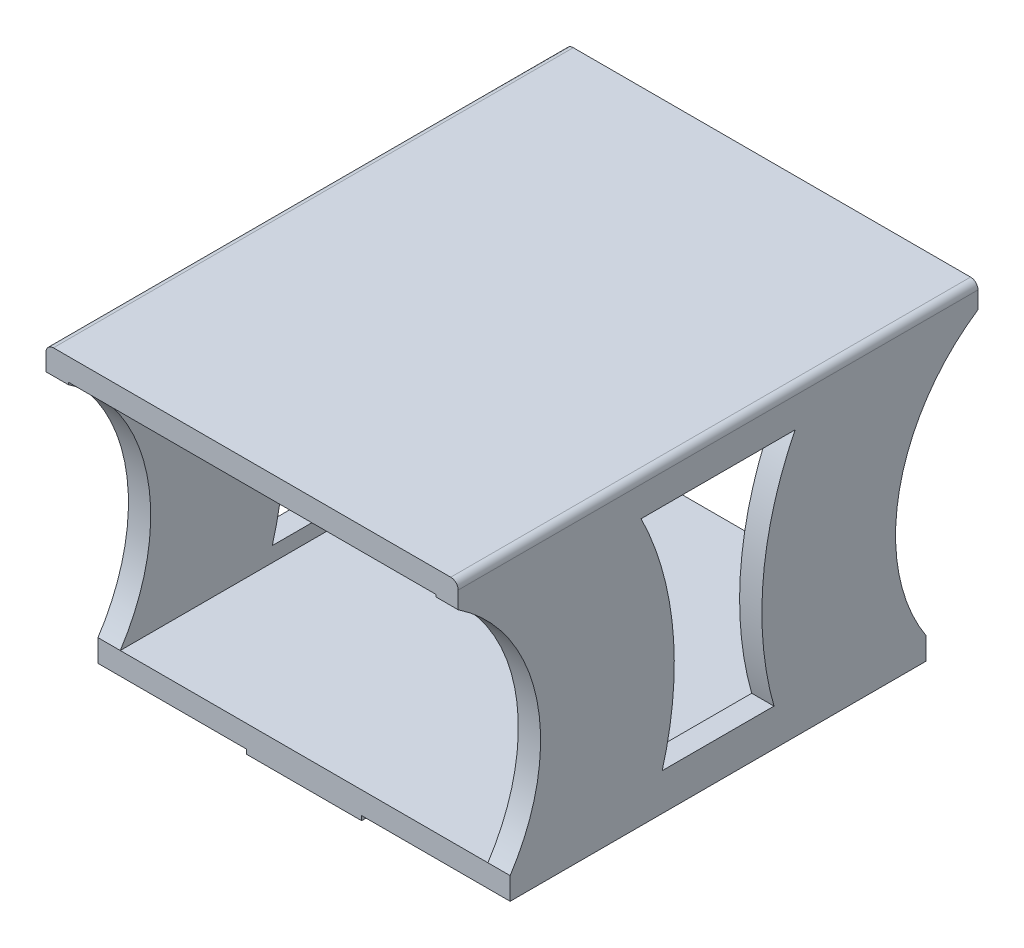
ISO-10303-21;
HEADER;
FILE_DESCRIPTION(('STEP AP214'),'2;1');
FILE_NAME('part.step','',(''),(''),'','','');
FILE_SCHEMA(('AUTOMOTIVE_DESIGN { 1 0 10303 214 1 1 1 1 }'));
ENDSEC;
DATA;
#1=APPLICATION_CONTEXT('core data for automotive mechanical design processes');
#2=APPLICATION_PROTOCOL_DEFINITION('international standard','automotive_design',2000,#1);
#3=PRODUCT_CONTEXT('',#1,'mechanical');
#4=PRODUCT('Part','Part','',(#3));
#5=PRODUCT_RELATED_PRODUCT_CATEGORY('part','',(#4));
#6=PRODUCT_DEFINITION_FORMATION('','',#4);
#7=PRODUCT_DEFINITION_CONTEXT('part definition',#1,'design');
#8=PRODUCT_DEFINITION('design','',#6,#7);
#9=PRODUCT_DEFINITION_SHAPE('','',#8);
#10=(LENGTH_UNIT() NAMED_UNIT(*) SI_UNIT(.MILLI.,.METRE.));
#11=(NAMED_UNIT(*) PLANE_ANGLE_UNIT() SI_UNIT($,.RADIAN.));
#12=(NAMED_UNIT(*) SI_UNIT($,.STERADIAN.) SOLID_ANGLE_UNIT());
#13=UNCERTAINTY_MEASURE_WITH_UNIT(LENGTH_MEASURE(1.E-05),#10,'distance_accuracy_value','');
#14=(GEOMETRIC_REPRESENTATION_CONTEXT(3) GLOBAL_UNCERTAINTY_ASSIGNED_CONTEXT((#13)) GLOBAL_UNIT_ASSIGNED_CONTEXT((#10,
#11,#12)) REPRESENTATION_CONTEXT('',''));
#15=CARTESIAN_POINT('',(0.,0.,0.));
#16=DIRECTION('',(0.,0.,1.));
#17=DIRECTION('',(1.,0.,0.));
#18=AXIS2_PLACEMENT_3D('',#15,#16,#17);
#19=CARTESIAN_POINT('',(0.,0.,0.));
#20=DIRECTION('',(0.,1.,0.));
#21=DIRECTION('',(0.,0.,1.));
#22=AXIS2_PLACEMENT_3D('',#19,#20,#21);
#23=PLANE('',#22);
#24=DIRECTION('',(0.,0.,-1.));
#25=VECTOR('',#24,1.);
#26=CARTESIAN_POINT('',(-7.75,0.,28.));
#27=LINE('',#26,#25);
#28=CARTESIAN_POINT('',(-7.75,0.,28.));
#29=VERTEX_POINT('',#28);
#30=CARTESIAN_POINT('',(-7.75,0.,-28.));
#31=VERTEX_POINT('',#30);
#32=EDGE_CURVE('E252',#29,#31,#27,.T.);
#33=ORIENTED_EDGE('',*,*,#32,.F.);
#34=DIRECTION('',(1.,0.,0.));
#35=VECTOR('',#34,1.);
#36=CARTESIAN_POINT('',(-27.75,0.,28.));
#37=LINE('',#36,#35);
#38=CARTESIAN_POINT('',(-27.75,0.,28.));
#39=VERTEX_POINT('',#38);
#40=EDGE_CURVE('E441',#39,#29,#37,.T.);
#41=ORIENTED_EDGE('',*,*,#40,.F.);
#42=DIRECTION('',(0.,0.,1.));
#43=VECTOR('',#42,1.);
#44=CARTESIAN_POINT('',(-27.75,0.,-28.));
#45=LINE('',#44,#43);
#46=CARTESIAN_POINT('',(-27.75,0.,-28.));
#47=VERTEX_POINT('',#46);
#48=EDGE_CURVE('E452',#47,#39,#45,.T.);
#49=ORIENTED_EDGE('',*,*,#48,.F.);
#50=DIRECTION('',(-1.,0.,0.));
#51=VECTOR('',#50,1.);
#52=CARTESIAN_POINT('',(-27.75,0.,-28.));
#53=LINE('',#52,#51);
#54=EDGE_CURVE('E449',#31,#47,#53,.T.);
#55=ORIENTED_EDGE('',*,*,#54,.F.);
#56=EDGE_LOOP('',(#33,#41,#49,#55));
#57=FACE_BOUND('',#56,.T.);
#58=ADVANCED_FACE('F41',(#57),#23,.F.);
#59=DIRECTION('',(0.,0.,1.));
#60=VECTOR('',#59,1.);
#61=CARTESIAN_POINT('',(7.75,0.,28.));
#62=LINE('',#61,#60);
#63=CARTESIAN_POINT('',(7.75,0.,-28.));
#64=VERTEX_POINT('',#63);
#65=CARTESIAN_POINT('',(7.75,0.,28.));
#66=VERTEX_POINT('',#65);
#67=EDGE_CURVE('E581',#64,#66,#62,.T.);
#68=ORIENTED_EDGE('',*,*,#67,.F.);
#69=CARTESIAN_POINT('',(27.75,0.,-28.));
#70=VERTEX_POINT('',#69);
#71=EDGE_CURVE('E258',#70,#64,#53,.T.);
#72=ORIENTED_EDGE('',*,*,#71,.F.);
#73=DIRECTION('',(0.,0.,-1.));
#74=VECTOR('',#73,1.);
#75=CARTESIAN_POINT('',(27.75,0.,-28.));
#76=LINE('',#75,#74);
#77=CARTESIAN_POINT('',(27.75,0.,28.));
#78=VERTEX_POINT('',#77);
#79=EDGE_CURVE('E435',#78,#70,#76,.T.);
#80=ORIENTED_EDGE('',*,*,#79,.F.);
#81=EDGE_CURVE('E456',#66,#78,#37,.T.);
#82=ORIENTED_EDGE('',*,*,#81,.F.);
#83=EDGE_LOOP('',(#68,#72,#80,#82));
#84=FACE_BOUND('',#83,.T.);
#85=ADVANCED_FACE('F611',(#84),#23,.F.);
#86=CARTESIAN_POINT('',(27.75,3.,-28.));
#87=DIRECTION('',(-1.,0.,0.));
#88=DIRECTION('',(0.,0.,1.));
#89=AXIS2_PLACEMENT_3D('',#86,#87,#88);
#90=PLANE('',#89);
#91=CARTESIAN_POINT('',(27.75,16.7197694496603,48.8989934266741));
#92=DIRECTION('',(1.,0.,0.));
#93=DIRECTION('',(0.,0.,-1.));
#94=AXIS2_PLACEMENT_3D('',#91,#92,#93);
#95=CIRCLE('',#94,43.);
#96=CARTESIAN_POINT('',(27.75,5.,7.52693759128191));
#97=VERTEX_POINT('',#96);
#98=CARTESIAN_POINT('',(27.75,35.8,10.3640118885199));
#99=VERTEX_POINT('',#98);
#100=EDGE_CURVE('E281',#97,#99,#95,.T.);
#101=ORIENTED_EDGE('',*,*,#100,.T.);
#102=DIRECTION('',(0.,0.,-1.));
#103=VECTOR('',#102,1.);
#104=CARTESIAN_POINT('',(27.75,35.8,10.3640118885199));
#105=LINE('',#104,#103);
#106=CARTESIAN_POINT('',(27.75,35.8,-10.3640118885199));
#107=VERTEX_POINT('',#106);
#108=EDGE_CURVE('E293',#99,#107,#105,.T.);
#109=ORIENTED_EDGE('',*,*,#108,.T.);
#110=CARTESIAN_POINT('',(27.75,16.7197694496603,-48.8989934266741));
#111=DIRECTION('',(-1.,0.,0.));
#112=DIRECTION('',(0.,0.,1.));
#113=AXIS2_PLACEMENT_3D('',#110,#111,#112);
#114=CIRCLE('',#113,43.);
#115=CARTESIAN_POINT('',(27.75,5.,-7.52693759128192));
#116=VERTEX_POINT('',#115);
#117=EDGE_CURVE('E297',#116,#107,#114,.T.);
#118=ORIENTED_EDGE('',*,*,#117,.F.);
#119=DIRECTION('',(0.,0.,-1.));
#120=VECTOR('',#119,1.);
#121=CARTESIAN_POINT('',(27.75,5.,7.52693759128192));
#122=LINE('',#121,#120);
#123=EDGE_CURVE('E301',#97,#116,#122,.T.);
#124=ORIENTED_EDGE('',*,*,#123,.F.);
#125=EDGE_LOOP('',(#101,#109,#118,#124));
#126=FACE_BOUND('',#125,.T.);
#127=DIRECTION('',(0.,1.,0.));
#128=VECTOR('',#127,1.);
#129=CARTESIAN_POINT('',(27.75,37.5,-35.));
#130=LINE('',#129,#128);
#131=CARTESIAN_POINT('',(27.75,37.5,-35.));
#132=VERTEX_POINT('',#131);
#133=CARTESIAN_POINT('',(27.75,39.8,-35.));
#134=VERTEX_POINT('',#133);
#135=EDGE_CURVE('E372',#132,#134,#130,.T.);
#136=ORIENTED_EDGE('',*,*,#135,.T.);
#137=DIRECTION('',(0.,0.,-1.));
#138=VECTOR('',#137,1.);
#139=CARTESIAN_POINT('',(27.75,39.8,-28.));
#140=LINE('',#139,#138);
#141=CARTESIAN_POINT('',(27.75,39.8,35.));
#142=VERTEX_POINT('',#141);
#143=EDGE_CURVE('E65',#134,#142,#140,.F.);
#144=ORIENTED_EDGE('',*,*,#143,.T.);
#145=DIRECTION('',(0.,1.,0.));
#146=VECTOR('',#145,1.);
#147=CARTESIAN_POINT('',(27.75,40.8,35.));
#148=LINE('',#147,#146);
#149=CARTESIAN_POINT('',(27.75,37.5,35.));
#150=VERTEX_POINT('',#149);
#151=EDGE_CURVE('E368',#150,#142,#148,.T.);
#152=ORIENTED_EDGE('',*,*,#151,.F.);
#153=CARTESIAN_POINT('',(27.75,16.7197694496603,48.8989934266741));
#154=DIRECTION('',(1.,0.,0.));
#155=DIRECTION('',(0.,0.,-1.));
#156=AXIS2_PLACEMENT_3D('',#153,#154,#155);
#157=CIRCLE('',#156,25.);
#158=CARTESIAN_POINT('',(27.75,2.99999999999999,28.));
#159=VERTEX_POINT('',#158);
#160=EDGE_CURVE('E279',#159,#150,#157,.T.);
#161=ORIENTED_EDGE('',*,*,#160,.F.);
#162=DIRECTION('',(0.,-1.,0.));
#163=VECTOR('',#162,1.);
#164=CARTESIAN_POINT('',(27.75,3.,28.));
#165=LINE('',#164,#163);
#166=EDGE_CURVE('E445',#159,#78,#165,.T.);
#167=ORIENTED_EDGE('',*,*,#166,.T.);
#168=ORIENTED_EDGE('',*,*,#79,.T.);
#169=DIRECTION('',(0.,-1.,0.));
#170=VECTOR('',#169,1.);
#171=CARTESIAN_POINT('',(27.75,3.,-28.));
#172=LINE('',#171,#170);
#173=CARTESIAN_POINT('',(27.75,3.,-28.));
#174=VERTEX_POINT('',#173);
#175=EDGE_CURVE('E470',#174,#70,#172,.T.);
#176=ORIENTED_EDGE('',*,*,#175,.F.);
#177=CARTESIAN_POINT('',(27.75,16.7197694496603,-48.8989934266741));
#178=DIRECTION('',(-1.,0.,0.));
#179=DIRECTION('',(0.,0.,1.));
#180=AXIS2_PLACEMENT_3D('',#177,#178,#179);
#181=CIRCLE('',#180,25.);
#182=EDGE_CURVE('E286',#174,#132,#181,.T.);
#183=ORIENTED_EDGE('',*,*,#182,.T.);
#184=EDGE_LOOP('',(#136,#144,#152,#161,#167,#168,#176,#183));
#185=FACE_BOUND('',#184,.T.);
#186=ADVANCED_FACE('F523',(#126,#185),#90,.F.);
#187=CARTESIAN_POINT('',(-27.75,3.,-28.));
#188=DIRECTION('',(1.,0.,0.));
#189=DIRECTION('',(0.,0.,-1.));
#190=AXIS2_PLACEMENT_3D('',#187,#188,#189);
#191=PLANE('',#190);
#192=CARTESIAN_POINT('',(-27.75,16.7197694496603,48.8989934266741));
#193=DIRECTION('',(1.,0.,0.));
#194=DIRECTION('',(0.,0.,-1.));
#195=AXIS2_PLACEMENT_3D('',#192,#193,#194);
#196=CIRCLE('',#195,43.);
#197=CARTESIAN_POINT('',(-27.75,5.,7.52693759128192));
#198=VERTEX_POINT('',#197);
#199=CARTESIAN_POINT('',(-27.75,35.8,10.3640118885199));
#200=VERTEX_POINT('',#199);
#201=EDGE_CURVE('E305',#198,#200,#196,.T.);
#202=ORIENTED_EDGE('',*,*,#201,.F.);
#203=DIRECTION('',(0.,0.,-1.));
#204=VECTOR('',#203,1.);
#205=CARTESIAN_POINT('',(-27.75,5.,7.52693759128192));
#206=LINE('',#205,#204);
#207=CARTESIAN_POINT('',(-27.75,5.,-7.52693759128191));
#208=VERTEX_POINT('',#207);
#209=EDGE_CURVE('E315',#198,#208,#206,.T.);
#210=ORIENTED_EDGE('',*,*,#209,.T.);
#211=CARTESIAN_POINT('',(-27.75,16.7197694496603,-48.8989934266741));
#212=DIRECTION('',(-1.,0.,0.));
#213=DIRECTION('',(0.,0.,1.));
#214=AXIS2_PLACEMENT_3D('',#211,#212,#213);
#215=CIRCLE('',#214,43.);
#216=CARTESIAN_POINT('',(-27.75,35.8,-10.3640118885199));
#217=VERTEX_POINT('',#216);
#218=EDGE_CURVE('E311',#208,#217,#215,.T.);
#219=ORIENTED_EDGE('',*,*,#218,.T.);
#220=DIRECTION('',(0.,0.,-1.));
#221=VECTOR('',#220,1.);
#222=CARTESIAN_POINT('',(-27.75,35.8,10.3640118885199));
#223=LINE('',#222,#221);
#224=EDGE_CURVE('E308',#200,#217,#223,.T.);
#225=ORIENTED_EDGE('',*,*,#224,.F.);
#226=EDGE_LOOP('',(#202,#210,#219,#225));
#227=FACE_BOUND('',#226,.T.);
#228=DIRECTION('',(0.,-1.,0.));
#229=VECTOR('',#228,1.);
#230=CARTESIAN_POINT('',(-27.75,40.8,35.));
#231=LINE('',#230,#229);
#232=CARTESIAN_POINT('',(-27.75,39.8,35.));
#233=VERTEX_POINT('',#232);
#234=CARTESIAN_POINT('',(-27.75,37.5,35.));
#235=VERTEX_POINT('',#234);
#236=EDGE_CURVE('E375',#233,#235,#231,.T.);
#237=ORIENTED_EDGE('',*,*,#236,.F.);
#238=DIRECTION('',(0.,0.,-1.));
#239=VECTOR('',#238,1.);
#240=CARTESIAN_POINT('',(-27.75,39.8,-28.));
#241=LINE('',#240,#239);
#242=CARTESIAN_POINT('',(-27.75,39.8,-35.));
#243=VERTEX_POINT('',#242);
#244=EDGE_CURVE('E11',#233,#243,#241,.T.);
#245=ORIENTED_EDGE('',*,*,#244,.T.);
#246=DIRECTION('',(0.,-1.,0.));
#247=VECTOR('',#246,1.);
#248=CARTESIAN_POINT('',(-27.75,37.5,-35.));
#249=LINE('',#248,#247);
#250=CARTESIAN_POINT('',(-27.75,37.5,-35.));
#251=VERTEX_POINT('',#250);
#252=EDGE_CURVE('E393',#243,#251,#249,.T.);
#253=ORIENTED_EDGE('',*,*,#252,.T.);
#254=CARTESIAN_POINT('',(-27.75,16.7197694496603,-48.8989934266741));
#255=DIRECTION('',(-1.,0.,0.));
#256=DIRECTION('',(0.,0.,1.));
#257=AXIS2_PLACEMENT_3D('',#254,#255,#256);
#258=CIRCLE('',#257,25.);
#259=CARTESIAN_POINT('',(-27.75,3.,-28.));
#260=VERTEX_POINT('',#259);
#261=EDGE_CURVE('E264',#260,#251,#258,.T.);
#262=ORIENTED_EDGE('',*,*,#261,.F.);
#263=DIRECTION('',(0.,-1.,0.));
#264=VECTOR('',#263,1.);
#265=CARTESIAN_POINT('',(-27.75,3.,-28.));
#266=LINE('',#265,#264);
#267=EDGE_CURVE('E466',#260,#47,#266,.T.);
#268=ORIENTED_EDGE('',*,*,#267,.T.);
#269=ORIENTED_EDGE('',*,*,#48,.T.);
#270=DIRECTION('',(0.,-1.,0.));
#271=VECTOR('',#270,1.);
#272=CARTESIAN_POINT('',(-27.75,3.,28.));
#273=LINE('',#272,#271);
#274=CARTESIAN_POINT('',(-27.75,3.,28.));
#275=VERTEX_POINT('',#274);
#276=EDGE_CURVE('E463',#275,#39,#273,.T.);
#277=ORIENTED_EDGE('',*,*,#276,.F.);
#278=CARTESIAN_POINT('',(-27.75,16.7197694496603,48.8989934266741));
#279=DIRECTION('',(1.,0.,0.));
#280=DIRECTION('',(0.,0.,-1.));
#281=AXIS2_PLACEMENT_3D('',#278,#279,#280);
#282=CIRCLE('',#281,25.);
#283=EDGE_CURVE('E274',#275,#235,#282,.T.);
#284=ORIENTED_EDGE('',*,*,#283,.T.);
#285=EDGE_LOOP('',(#237,#245,#253,#262,#268,#269,#277,#284));
#286=FACE_BOUND('',#285,.T.);
#287=ADVANCED_FACE('F565',(#227,#286),#191,.F.);
#288=CARTESIAN_POINT('',(-24.75,37.8,28.));
#289=DIRECTION('',(-1.,0.,0.));
#290=DIRECTION('',(0.,-1.,0.));
#291=AXIS2_PLACEMENT_3D('',#288,#289,#290);
#292=PLANE('',#291);
#293=CARTESIAN_POINT('',(-24.75,16.7197694496603,48.8989934266741));
#294=DIRECTION('',(-1.,0.,0.));
#295=DIRECTION('',(0.,-1.,0.));
#296=AXIS2_PLACEMENT_3D('',#293,#294,#295);
#297=CIRCLE('',#296,43.);
#298=CARTESIAN_POINT('',(-24.75,35.8,10.3640118885199));
#299=VERTEX_POINT('',#298);
#300=CARTESIAN_POINT('',(-24.75,5.,7.52693759128191));
#301=VERTEX_POINT('',#300);
#302=EDGE_CURVE('E363',#299,#301,#297,.T.);
#303=ORIENTED_EDGE('',*,*,#302,.F.);
#304=DIRECTION('',(0.,0.,1.));
#305=VECTOR('',#304,1.);
#306=CARTESIAN_POINT('',(-24.75,35.8,28.));
#307=LINE('',#306,#305);
#308=CARTESIAN_POINT('',(-24.75,35.8,-10.3640118885199));
#309=VERTEX_POINT('',#308);
#310=EDGE_CURVE('E360',#309,#299,#307,.T.);
#311=ORIENTED_EDGE('',*,*,#310,.F.);
#312=CARTESIAN_POINT('',(-24.75,16.7197694496603,-48.8989934266741));
#313=DIRECTION('',(-1.,0.,0.));
#314=DIRECTION('',(0.,-1.,0.));
#315=AXIS2_PLACEMENT_3D('',#312,#313,#314);
#316=CIRCLE('',#315,43.);
#317=CARTESIAN_POINT('',(-24.75,5.,-7.52693759128192));
#318=VERTEX_POINT('',#317);
#319=EDGE_CURVE('E356',#309,#318,#316,.F.);
#320=ORIENTED_EDGE('',*,*,#319,.T.);
#321=DIRECTION('',(0.,0.,1.));
#322=VECTOR('',#321,1.);
#323=CARTESIAN_POINT('',(-24.75,5.,28.));
#324=LINE('',#323,#322);
#325=EDGE_CURVE('E352',#318,#301,#324,.T.);
#326=ORIENTED_EDGE('',*,*,#325,.T.);
#327=EDGE_LOOP('',(#303,#311,#320,#326));
#328=FACE_BOUND('',#327,.T.);
#329=CARTESIAN_POINT('',(-24.75,16.7197694496603,-48.8989934266741));
#330=DIRECTION('',(-1.,0.,0.));
#331=DIRECTION('',(0.,-1.,0.));
#332=AXIS2_PLACEMENT_3D('',#329,#330,#331);
#333=CIRCLE('',#332,25.);
#334=CARTESIAN_POINT('',(-24.75,37.5,-35.));
#335=VERTEX_POINT('',#334);
#336=CARTESIAN_POINT('',(-24.75,3.,-28.));
#337=VERTEX_POINT('',#336);
#338=EDGE_CURVE('E341',#335,#337,#333,.F.);
#339=ORIENTED_EDGE('',*,*,#338,.F.);
#340=DIRECTION('',(0.,1.,0.));
#341=VECTOR('',#340,1.);
#342=CARTESIAN_POINT('',(-24.75,37.8,-35.));
#343=LINE('',#342,#341);
#344=CARTESIAN_POINT('',(-24.75,37.8,-35.));
#345=VERTEX_POINT('',#344);
#346=EDGE_CURVE('E396',#335,#345,#343,.T.);
#347=ORIENTED_EDGE('',*,*,#346,.T.);
#348=DIRECTION('',(0.,0.,-1.));
#349=VECTOR('',#348,1.);
#350=CARTESIAN_POINT('',(-24.75,37.8,28.));
#351=LINE('',#350,#349);
#352=CARTESIAN_POINT('',(-24.75,37.8,35.));
#353=VERTEX_POINT('',#352);
#354=EDGE_CURVE('E427',#353,#345,#351,.T.);
#355=ORIENTED_EDGE('',*,*,#354,.F.);
#356=DIRECTION('',(0.,1.,0.));
#357=VECTOR('',#356,1.);
#358=CARTESIAN_POINT('',(-24.75,37.8,35.));
#359=LINE('',#358,#357);
#360=CARTESIAN_POINT('',(-24.75,37.5,35.));
#361=VERTEX_POINT('',#360);
#362=EDGE_CURVE('E378',#361,#353,#359,.T.);
#363=ORIENTED_EDGE('',*,*,#362,.F.);
#364=CARTESIAN_POINT('',(-24.75,16.7197694496603,48.8989934266741));
#365=DIRECTION('',(-1.,0.,0.));
#366=DIRECTION('',(0.,-1.,0.));
#367=AXIS2_PLACEMENT_3D('',#364,#365,#366);
#368=CIRCLE('',#367,25.);
#369=CARTESIAN_POINT('',(-24.75,2.99999999999999,28.));
#370=VERTEX_POINT('',#369);
#371=EDGE_CURVE('E348',#361,#370,#368,.T.);
#372=ORIENTED_EDGE('',*,*,#371,.T.);
#373=DIRECTION('',(0.,0.,-1.));
#374=VECTOR('',#373,1.);
#375=CARTESIAN_POINT('',(-24.75,3.,28.));
#376=LINE('',#375,#374);
#377=EDGE_CURVE('E431',#370,#337,#376,.T.);
#378=ORIENTED_EDGE('',*,*,#377,.T.);
#379=EDGE_LOOP('',(#339,#347,#355,#363,#372,#378));
#380=FACE_BOUND('',#379,.T.);
#381=ADVANCED_FACE('F545',(#328,#380),#292,.F.);
#382=CARTESIAN_POINT('',(24.75,37.8,28.));
#383=DIRECTION('',(1.,0.,0.));
#384=DIRECTION('',(0.,1.,0.));
#385=AXIS2_PLACEMENT_3D('',#382,#383,#384);
#386=PLANE('',#385);
#387=CARTESIAN_POINT('',(24.75,16.7197694496603,48.8989934266741));
#388=DIRECTION('',(1.,0.,0.));
#389=DIRECTION('',(0.,1.,0.));
#390=AXIS2_PLACEMENT_3D('',#387,#388,#389);
#391=CIRCLE('',#390,43.);
#392=CARTESIAN_POINT('',(24.75,5.,7.52693759128192));
#393=VERTEX_POINT('',#392);
#394=CARTESIAN_POINT('',(24.75,35.8,10.3640118885199));
#395=VERTEX_POINT('',#394);
#396=EDGE_CURVE('E487',#393,#395,#391,.T.);
#397=ORIENTED_EDGE('',*,*,#396,.F.);
#398=DIRECTION('',(0.,0.,-1.));
#399=VECTOR('',#398,1.);
#400=CARTESIAN_POINT('',(24.75,5.,28.));
#401=LINE('',#400,#399);
#402=CARTESIAN_POINT('',(24.75,5.,-7.52693759128191));
#403=VERTEX_POINT('',#402);
#404=EDGE_CURVE('E476',#393,#403,#401,.T.);
#405=ORIENTED_EDGE('',*,*,#404,.T.);
#406=CARTESIAN_POINT('',(24.75,16.7197694496603,-48.8989934266741));
#407=DIRECTION('',(1.,0.,0.));
#408=DIRECTION('',(0.,1.,0.));
#409=AXIS2_PLACEMENT_3D('',#406,#407,#408);
#410=CIRCLE('',#409,43.);
#411=CARTESIAN_POINT('',(24.75,35.8,-10.3640118885199));
#412=VERTEX_POINT('',#411);
#413=EDGE_CURVE('E480',#403,#412,#410,.F.);
#414=ORIENTED_EDGE('',*,*,#413,.T.);
#415=DIRECTION('',(0.,0.,-1.));
#416=VECTOR('',#415,1.);
#417=CARTESIAN_POINT('',(24.75,35.8,28.));
#418=LINE('',#417,#416);
#419=EDGE_CURVE('E484',#395,#412,#418,.T.);
#420=ORIENTED_EDGE('',*,*,#419,.F.);
#421=EDGE_LOOP('',(#397,#405,#414,#420));
#422=FACE_BOUND('',#421,.T.);
#423=CARTESIAN_POINT('',(24.75,16.7197694496603,-48.8989934266741));
#424=DIRECTION('',(1.,0.,0.));
#425=DIRECTION('',(0.,1.,0.));
#426=AXIS2_PLACEMENT_3D('',#423,#424,#425);
#427=CIRCLE('',#426,25.);
#428=CARTESIAN_POINT('',(24.75,3.,-28.));
#429=VERTEX_POINT('',#428);
#430=CARTESIAN_POINT('',(24.75,37.5,-35.));
#431=VERTEX_POINT('',#430);
#432=EDGE_CURVE('E338',#429,#431,#427,.F.);
#433=ORIENTED_EDGE('',*,*,#432,.F.);
#434=DIRECTION('',(0.,0.,-1.));
#435=VECTOR('',#434,1.);
#436=CARTESIAN_POINT('',(24.75,3.,28.));
#437=LINE('',#436,#435);
#438=CARTESIAN_POINT('',(24.75,3.,28.));
#439=VERTEX_POINT('',#438);
#440=EDGE_CURVE('E420',#439,#429,#437,.T.);
#441=ORIENTED_EDGE('',*,*,#440,.F.);
#442=CARTESIAN_POINT('',(24.75,16.7197694496603,48.8989934266741));
#443=DIRECTION('',(1.,0.,0.));
#444=DIRECTION('',(0.,1.,0.));
#445=AXIS2_PLACEMENT_3D('',#442,#443,#444);
#446=CIRCLE('',#445,25.);
#447=CARTESIAN_POINT('',(24.75,37.5,35.));
#448=VERTEX_POINT('',#447);
#449=EDGE_CURVE('E344',#439,#448,#446,.T.);
#450=ORIENTED_EDGE('',*,*,#449,.T.);
#451=DIRECTION('',(0.,-1.,0.));
#452=VECTOR('',#451,1.);
#453=CARTESIAN_POINT('',(24.75,37.8,35.));
#454=LINE('',#453,#452);
#455=CARTESIAN_POINT('',(24.75,37.8,35.));
#456=VERTEX_POINT('',#455);
#457=EDGE_CURVE('E385',#456,#448,#454,.T.);
#458=ORIENTED_EDGE('',*,*,#457,.F.);
#459=DIRECTION('',(0.,0.,-1.));
#460=VECTOR('',#459,1.);
#461=CARTESIAN_POINT('',(24.75,37.8,28.));
#462=LINE('',#461,#460);
#463=CARTESIAN_POINT('',(24.75,37.8,-35.));
#464=VERTEX_POINT('',#463);
#465=EDGE_CURVE('E424',#456,#464,#462,.T.);
#466=ORIENTED_EDGE('',*,*,#465,.T.);
#467=DIRECTION('',(0.,-1.,0.));
#468=VECTOR('',#467,1.);
#469=CARTESIAN_POINT('',(24.75,37.8,-35.));
#470=LINE('',#469,#468);
#471=EDGE_CURVE('E403',#464,#431,#470,.T.);
#472=ORIENTED_EDGE('',*,*,#471,.T.);
#473=EDGE_LOOP('',(#433,#441,#450,#458,#466,#472));
#474=FACE_BOUND('',#473,.T.);
#475=ADVANCED_FACE('F532',(#422,#474),#386,.F.);
#476=CARTESIAN_POINT('',(0.,0.,-35.));
#477=DIRECTION('',(0.,0.,1.));
#478=DIRECTION('',(1.,0.,0.));
#479=AXIS2_PLACEMENT_3D('',#476,#477,#478);
#480=PLANE('',#479);
#481=DIRECTION('',(-1.,0.,0.));
#482=VECTOR('',#481,1.);
#483=CARTESIAN_POINT('',(27.75,40.8,-35.));
#484=LINE('',#483,#482);
#485=CARTESIAN_POINT('',(26.75,40.8,-35.));
#486=VERTEX_POINT('',#485);
#487=CARTESIAN_POINT('',(-26.75,40.8,-35.));
#488=VERTEX_POINT('',#487);
#489=EDGE_CURVE('E367',#486,#488,#484,.T.);
#490=ORIENTED_EDGE('',*,*,#489,.F.);
#491=CARTESIAN_POINT('',(26.75,39.8,-35.));
#492=DIRECTION('',(0.,0.,1.));
#493=DIRECTION('',(1.,0.,0.));
#494=AXIS2_PLACEMENT_3D('',#491,#492,#493);
#495=CIRCLE('',#494,1.);
#496=EDGE_CURVE('E501',#486,#134,#495,.F.);
#497=ORIENTED_EDGE('',*,*,#496,.T.);
#498=ORIENTED_EDGE('',*,*,#135,.F.);
#499=DIRECTION('',(1.,0.,0.));
#500=VECTOR('',#499,1.);
#501=CARTESIAN_POINT('',(-27.75,37.5,-35.));
#502=LINE('',#501,#500);
#503=EDGE_CURVE('E473',#431,#132,#502,.T.);
#504=ORIENTED_EDGE('',*,*,#503,.F.);
#505=ORIENTED_EDGE('',*,*,#471,.F.);
#506=DIRECTION('',(1.,0.,0.));
#507=VECTOR('',#506,1.);
#508=CARTESIAN_POINT('',(24.75,37.8,-35.));
#509=LINE('',#508,#507);
#510=EDGE_CURVE('E399',#345,#464,#509,.T.);
#511=ORIENTED_EDGE('',*,*,#510,.F.);
#512=ORIENTED_EDGE('',*,*,#346,.F.);
#513=DIRECTION('',(1.,0.,0.));
#514=VECTOR('',#513,1.);
#515=CARTESIAN_POINT('',(-27.75,37.5,-35.));
#516=LINE('',#515,#514);
#517=EDGE_CURVE('E260',#251,#335,#516,.T.);
#518=ORIENTED_EDGE('',*,*,#517,.F.);
#519=ORIENTED_EDGE('',*,*,#252,.F.);
#520=CARTESIAN_POINT('',(-26.75,39.8,-35.));
#521=DIRECTION('',(0.,0.,1.));
#522=DIRECTION('',(1.,0.,0.));
#523=AXIS2_PLACEMENT_3D('',#520,#521,#522);
#524=CIRCLE('',#523,1.);
#525=EDGE_CURVE('E498',#243,#488,#524,.F.);
#526=ORIENTED_EDGE('',*,*,#525,.T.);
#527=EDGE_LOOP('',(#490,#497,#498,#504,#505,#511,#512,#518,#519,#526));
#528=FACE_BOUND('',#527,.T.);
#529=ADVANCED_FACE('F521',(#528),#480,.F.);
#530=CARTESIAN_POINT('',(-27.75,3.,-28.));
#531=DIRECTION('',(0.,0.,1.));
#532=DIRECTION('',(1.,0.,0.));
#533=AXIS2_PLACEMENT_3D('',#530,#531,#532);
#534=PLANE('',#533);
#535=DIRECTION('',(-1.,0.,0.));
#536=VECTOR('',#535,1.);
#537=CARTESIAN_POINT('',(-27.75,3.,-28.));
#538=LINE('',#537,#536);
#539=EDGE_CURVE('E417',#337,#260,#538,.T.);
#540=ORIENTED_EDGE('',*,*,#539,.F.);
#541=DIRECTION('',(-1.,0.,0.));
#542=VECTOR('',#541,1.);
#543=CARTESIAN_POINT('',(-27.75,3.,-28.));
#544=LINE('',#543,#542);
#545=EDGE_CURVE('E436',#429,#337,#544,.T.);
#546=ORIENTED_EDGE('',*,*,#545,.F.);
#547=DIRECTION('',(-1.,0.,0.));
#548=VECTOR('',#547,1.);
#549=CARTESIAN_POINT('',(-27.75,3.,-28.));
#550=LINE('',#549,#548);
#551=EDGE_CURVE('E411',#174,#429,#550,.T.);
#552=ORIENTED_EDGE('',*,*,#551,.F.);
#553=ORIENTED_EDGE('',*,*,#175,.T.);
#554=ORIENTED_EDGE('',*,*,#71,.T.);
#555=DIRECTION('',(0.,1.,0.));
#556=VECTOR('',#555,1.);
#557=CARTESIAN_POINT('',(7.74999999999999,-0.6,-28.));
#558=LINE('',#557,#556);
#559=CARTESIAN_POINT('',(7.74999999999999,-0.6,-28.));
#560=VERTEX_POINT('',#559);
#561=EDGE_CURVE('E235',#560,#64,#558,.T.);
#562=ORIENTED_EDGE('',*,*,#561,.F.);
#563=DIRECTION('',(1.,0.,0.));
#564=VECTOR('',#563,1.);
#565=CARTESIAN_POINT('',(-7.74999999999999,-0.6,-28.));
#566=LINE('',#565,#564);
#567=CARTESIAN_POINT('',(-7.74999999999999,-0.6,-28.));
#568=VERTEX_POINT('',#567);
#569=EDGE_CURVE('E242',#568,#560,#566,.T.);
#570=ORIENTED_EDGE('',*,*,#569,.F.);
#571=DIRECTION('',(0.,1.,0.));
#572=VECTOR('',#571,1.);
#573=CARTESIAN_POINT('',(-7.74999999999999,-0.6,-28.));
#574=LINE('',#573,#572);
#575=EDGE_CURVE('E575',#568,#31,#574,.T.);
#576=ORIENTED_EDGE('',*,*,#575,.T.);
#577=ORIENTED_EDGE('',*,*,#54,.T.);
#578=ORIENTED_EDGE('',*,*,#267,.F.);
#579=EDGE_LOOP('',(#540,#546,#552,#553,#554,#562,#570,#576,#577,#578));
#580=FACE_BOUND('',#579,.T.);
#581=ADVANCED_FACE('F256',(#580),#534,.F.);
#582=CARTESIAN_POINT('',(-27.75,3.,28.));
#583=DIRECTION('',(0.,0.,-1.));
#584=DIRECTION('',(-1.,0.,0.));
#585=AXIS2_PLACEMENT_3D('',#582,#583,#584);
#586=PLANE('',#585);
#587=DIRECTION('',(1.,0.,0.));
#588=VECTOR('',#587,1.);
#589=CARTESIAN_POINT('',(-27.75,3.,28.));
#590=LINE('',#589,#588);
#591=EDGE_CURVE('E414',#275,#370,#590,.T.);
#592=ORIENTED_EDGE('',*,*,#591,.F.);
#593=ORIENTED_EDGE('',*,*,#276,.T.);
#594=ORIENTED_EDGE('',*,*,#40,.T.);
#595=DIRECTION('',(0.,1.,0.));
#596=VECTOR('',#595,1.);
#597=CARTESIAN_POINT('',(-7.75,-0.6,28.));
#598=LINE('',#597,#596);
#599=CARTESIAN_POINT('',(-7.75,-0.6,28.));
#600=VERTEX_POINT('',#599);
#601=EDGE_CURVE('E266',#600,#29,#598,.T.);
#602=ORIENTED_EDGE('',*,*,#601,.F.);
#603=DIRECTION('',(-1.,0.,0.));
#604=VECTOR('',#603,1.);
#605=CARTESIAN_POINT('',(-7.75,-0.6,28.));
#606=LINE('',#605,#604);
#607=CARTESIAN_POINT('',(7.75,-0.6,28.));
#608=VERTEX_POINT('',#607);
#609=EDGE_CURVE('E241',#608,#600,#606,.T.);
#610=ORIENTED_EDGE('',*,*,#609,.F.);
#611=DIRECTION('',(0.,1.,0.));
#612=VECTOR('',#611,1.);
#613=CARTESIAN_POINT('',(7.75,-0.6,28.));
#614=LINE('',#613,#612);
#615=EDGE_CURVE('E237',#608,#66,#614,.T.);
#616=ORIENTED_EDGE('',*,*,#615,.T.);
#617=ORIENTED_EDGE('',*,*,#81,.T.);
#618=ORIENTED_EDGE('',*,*,#166,.F.);
#619=DIRECTION('',(1.,0.,0.));
#620=VECTOR('',#619,1.);
#621=CARTESIAN_POINT('',(-27.75,3.,28.));
#622=LINE('',#621,#620);
#623=EDGE_CURVE('E389',#439,#159,#622,.T.);
#624=ORIENTED_EDGE('',*,*,#623,.F.);
#625=DIRECTION('',(1.,0.,0.));
#626=VECTOR('',#625,1.);
#627=CARTESIAN_POINT('',(-27.75,3.,28.));
#628=LINE('',#627,#626);
#629=EDGE_CURVE('E440',#370,#439,#628,.T.);
#630=ORIENTED_EDGE('',*,*,#629,.F.);
#631=EDGE_LOOP('',(#592,#593,#594,#602,#610,#616,#617,#618,#624,#630));
#632=FACE_BOUND('',#631,.T.);
#633=ADVANCED_FACE('F563',(#632),#586,.F.);
#634=CARTESIAN_POINT('',(0.,3.,0.));
#635=DIRECTION('',(0.,1.,0.));
#636=DIRECTION('',(0.,0.,1.));
#637=AXIS2_PLACEMENT_3D('',#634,#635,#636);
#638=PLANE('',#637);
#639=ORIENTED_EDGE('',*,*,#545,.T.);
#640=ORIENTED_EDGE('',*,*,#377,.F.);
#641=ORIENTED_EDGE('',*,*,#629,.T.);
#642=ORIENTED_EDGE('',*,*,#440,.T.);
#643=EDGE_LOOP('',(#639,#640,#641,#642));
#644=FACE_BOUND('',#643,.T.);
#645=ADVANCED_FACE('F553',(#644),#638,.T.);
#646=CARTESIAN_POINT('',(-24.75,37.8,28.));
#647=DIRECTION('',(0.,1.,0.));
#648=DIRECTION('',(0.,0.,1.));
#649=AXIS2_PLACEMENT_3D('',#646,#647,#648);
#650=PLANE('',#649);
#651=ORIENTED_EDGE('',*,*,#354,.T.);
#652=ORIENTED_EDGE('',*,*,#510,.T.);
#653=ORIENTED_EDGE('',*,*,#465,.F.);
#654=DIRECTION('',(1.,0.,0.));
#655=VECTOR('',#654,1.);
#656=CARTESIAN_POINT('',(24.75,37.8,35.));
#657=LINE('',#656,#655);
#658=EDGE_CURVE('E381',#353,#456,#657,.T.);
#659=ORIENTED_EDGE('',*,*,#658,.F.);
#660=EDGE_LOOP('',(#651,#652,#653,#659));
#661=FACE_BOUND('',#660,.T.);
#662=ADVANCED_FACE('F538',(#661),#650,.F.);
#663=CARTESIAN_POINT('',(-27.75,40.8,28.));
#664=DIRECTION('',(0.,-1.,0.));
#665=DIRECTION('',(0.,0.,-1.));
#666=AXIS2_PLACEMENT_3D('',#663,#664,#665);
#667=PLANE('',#666);
#668=DIRECTION('',(-1.,0.,0.));
#669=VECTOR('',#668,1.);
#670=CARTESIAN_POINT('',(27.75,40.8,35.));
#671=LINE('',#670,#669);
#672=CARTESIAN_POINT('',(26.75,40.8,35.));
#673=VERTEX_POINT('',#672);
#674=CARTESIAN_POINT('',(-26.75,40.8,35.));
#675=VERTEX_POINT('',#674);
#676=EDGE_CURVE('E371',#673,#675,#671,.T.);
#677=ORIENTED_EDGE('',*,*,#676,.F.);
#678=DIRECTION('',(0.,0.,-1.));
#679=VECTOR('',#678,1.);
#680=CARTESIAN_POINT('',(26.75,40.8,28.));
#681=LINE('',#680,#679);
#682=EDGE_CURVE('E494',#673,#486,#681,.T.);
#683=ORIENTED_EDGE('',*,*,#682,.T.);
#684=ORIENTED_EDGE('',*,*,#489,.T.);
#685=DIRECTION('',(0.,0.,-1.));
#686=VECTOR('',#685,1.);
#687=CARTESIAN_POINT('',(-26.75,40.8,28.));
#688=LINE('',#687,#686);
#689=EDGE_CURVE('E491',#488,#675,#688,.F.);
#690=ORIENTED_EDGE('',*,*,#689,.T.);
#691=EDGE_LOOP('',(#677,#683,#684,#690));
#692=FACE_BOUND('',#691,.T.);
#693=ADVANCED_FACE('F515',(#692),#667,.F.);
#694=CARTESIAN_POINT('',(0.,0.,35.));
#695=DIRECTION('',(0.,0.,1.));
#696=DIRECTION('',(1.,0.,0.));
#697=AXIS2_PLACEMENT_3D('',#694,#695,#696);
#698=PLANE('',#697);
#699=ORIENTED_EDGE('',*,*,#151,.T.);
#700=CARTESIAN_POINT('',(26.75,39.8,35.));
#701=DIRECTION('',(0.,0.,1.));
#702=DIRECTION('',(1.,0.,0.));
#703=AXIS2_PLACEMENT_3D('',#700,#701,#702);
#704=CIRCLE('',#703,1.);
#705=EDGE_CURVE('E50',#142,#673,#704,.T.);
#706=ORIENTED_EDGE('',*,*,#705,.T.);
#707=ORIENTED_EDGE('',*,*,#676,.T.);
#708=CARTESIAN_POINT('',(-26.75,39.8,35.));
#709=DIRECTION('',(0.,0.,1.));
#710=DIRECTION('',(1.,0.,0.));
#711=AXIS2_PLACEMENT_3D('',#708,#709,#710);
#712=CIRCLE('',#711,1.);
#713=EDGE_CURVE('E57',#675,#233,#712,.T.);
#714=ORIENTED_EDGE('',*,*,#713,.T.);
#715=ORIENTED_EDGE('',*,*,#236,.T.);
#716=DIRECTION('',(1.,0.,0.));
#717=VECTOR('',#716,1.);
#718=CARTESIAN_POINT('',(-27.75,37.5,35.));
#719=LINE('',#718,#717);
#720=EDGE_CURVE('E270',#235,#361,#719,.T.);
#721=ORIENTED_EDGE('',*,*,#720,.T.);
#722=ORIENTED_EDGE('',*,*,#362,.T.);
#723=ORIENTED_EDGE('',*,*,#658,.T.);
#724=ORIENTED_EDGE('',*,*,#457,.T.);
#725=EDGE_CURVE('E275',#448,#150,#719,.T.);
#726=ORIENTED_EDGE('',*,*,#725,.T.);
#727=EDGE_LOOP('',(#699,#706,#707,#714,#715,#721,#722,#723,#724,#726));
#728=FACE_BOUND('',#727,.T.);
#729=ADVANCED_FACE('F510',(#728),#698,.T.);
#730=CARTESIAN_POINT('',(-27.75,16.7197694496603,-48.8989934266741));
#731=DIRECTION('',(1.,0.,0.));
#732=DIRECTION('',(0.,0.,-1.));
#733=AXIS2_PLACEMENT_3D('',#730,#731,#732);
#734=CYLINDRICAL_SURFACE('',#733,25.);
#735=ORIENTED_EDGE('',*,*,#432,.T.);
#736=ORIENTED_EDGE('',*,*,#503,.T.);
#737=ORIENTED_EDGE('',*,*,#182,.F.);
#738=ORIENTED_EDGE('',*,*,#551,.T.);
#739=EDGE_LOOP('',(#735,#736,#737,#738));
#740=FACE_BOUND('',#739,.T.);
#741=ADVANCED_FACE('F527',(#740),#734,.F.);
#742=ORIENTED_EDGE('',*,*,#338,.T.);
#743=ORIENTED_EDGE('',*,*,#539,.T.);
#744=ORIENTED_EDGE('',*,*,#261,.T.);
#745=ORIENTED_EDGE('',*,*,#517,.T.);
#746=EDGE_LOOP('',(#742,#743,#744,#745));
#747=FACE_BOUND('',#746,.T.);
#748=ADVANCED_FACE('F549',(#747),#734,.F.);
#749=CARTESIAN_POINT('',(-27.75,16.7197694496603,48.8989934266741));
#750=DIRECTION('',(1.,0.,0.));
#751=DIRECTION('',(0.,0.,-1.));
#752=AXIS2_PLACEMENT_3D('',#749,#750,#751);
#753=CYLINDRICAL_SURFACE('',#752,25.);
#754=ORIENTED_EDGE('',*,*,#720,.F.);
#755=ORIENTED_EDGE('',*,*,#283,.F.);
#756=ORIENTED_EDGE('',*,*,#591,.T.);
#757=ORIENTED_EDGE('',*,*,#371,.F.);
#758=EDGE_LOOP('',(#754,#755,#756,#757));
#759=FACE_BOUND('',#758,.T.);
#760=ADVANCED_FACE('F559',(#759),#753,.F.);
#761=ORIENTED_EDGE('',*,*,#623,.T.);
#762=ORIENTED_EDGE('',*,*,#160,.T.);
#763=ORIENTED_EDGE('',*,*,#725,.F.);
#764=ORIENTED_EDGE('',*,*,#449,.F.);
#765=EDGE_LOOP('',(#761,#762,#763,#764));
#766=FACE_BOUND('',#765,.T.);
#767=ADVANCED_FACE('F774',(#766),#753,.F.);
#768=CARTESIAN_POINT('',(-27.75,5.,7.52693759128192));
#769=DIRECTION('',(0.,-1.,0.));
#770=DIRECTION('',(0.,0.,-1.));
#771=AXIS2_PLACEMENT_3D('',#768,#769,#770);
#772=PLANE('',#771);
#773=DIRECTION('',(1.,0.,0.));
#774=VECTOR('',#773,1.);
#775=CARTESIAN_POINT('',(-27.75,5.,7.52693759128192));
#776=LINE('',#775,#774);
#777=EDGE_CURVE('E319',#393,#97,#776,.T.);
#778=ORIENTED_EDGE('',*,*,#777,.T.);
#779=ORIENTED_EDGE('',*,*,#123,.T.);
#780=DIRECTION('',(1.,0.,0.));
#781=VECTOR('',#780,1.);
#782=CARTESIAN_POINT('',(-27.75,5.,-7.52693759128192));
#783=LINE('',#782,#781);
#784=EDGE_CURVE('E323',#403,#116,#783,.T.);
#785=ORIENTED_EDGE('',*,*,#784,.F.);
#786=ORIENTED_EDGE('',*,*,#404,.F.);
#787=EDGE_LOOP('',(#778,#779,#785,#786));
#788=FACE_BOUND('',#787,.T.);
#789=ADVANCED_FACE('F781',(#788),#772,.F.);
#790=CARTESIAN_POINT('',(-27.75,16.7197694496603,-48.8989934266741));
#791=DIRECTION('',(1.,0.,0.));
#792=DIRECTION('',(0.,0.,-1.));
#793=AXIS2_PLACEMENT_3D('',#790,#791,#792);
#794=CYLINDRICAL_SURFACE('',#793,43.);
#795=ORIENTED_EDGE('',*,*,#784,.T.);
#796=ORIENTED_EDGE('',*,*,#117,.T.);
#797=DIRECTION('',(1.,0.,0.));
#798=VECTOR('',#797,1.);
#799=CARTESIAN_POINT('',(-27.75,35.8,-10.3640118885199));
#800=LINE('',#799,#798);
#801=EDGE_CURVE('E328',#412,#107,#800,.T.);
#802=ORIENTED_EDGE('',*,*,#801,.F.);
#803=ORIENTED_EDGE('',*,*,#413,.F.);
#804=EDGE_LOOP('',(#795,#796,#802,#803));
#805=FACE_BOUND('',#804,.T.);
#806=ADVANCED_FACE('F787',(#805),#794,.T.);
#807=CARTESIAN_POINT('',(-27.75,35.8,10.3640118885199));
#808=DIRECTION('',(0.,-1.,0.));
#809=DIRECTION('',(0.,0.,-1.));
#810=AXIS2_PLACEMENT_3D('',#807,#808,#809);
#811=PLANE('',#810);
#812=ORIENTED_EDGE('',*,*,#419,.T.);
#813=ORIENTED_EDGE('',*,*,#801,.T.);
#814=ORIENTED_EDGE('',*,*,#108,.F.);
#815=DIRECTION('',(1.,0.,0.));
#816=VECTOR('',#815,1.);
#817=CARTESIAN_POINT('',(-27.75,35.8,10.3640118885199));
#818=LINE('',#817,#816);
#819=EDGE_CURVE('E333',#395,#99,#818,.T.);
#820=ORIENTED_EDGE('',*,*,#819,.F.);
#821=EDGE_LOOP('',(#812,#813,#814,#820));
#822=FACE_BOUND('',#821,.T.);
#823=ADVANCED_FACE('F795',(#822),#811,.T.);
#824=CARTESIAN_POINT('',(-27.75,16.7197694496603,48.8989934266741));
#825=DIRECTION('',(1.,0.,0.));
#826=DIRECTION('',(0.,0.,-1.));
#827=AXIS2_PLACEMENT_3D('',#824,#825,#826);
#828=CYLINDRICAL_SURFACE('',#827,43.);
#829=ORIENTED_EDGE('',*,*,#396,.T.);
#830=ORIENTED_EDGE('',*,*,#819,.T.);
#831=ORIENTED_EDGE('',*,*,#100,.F.);
#832=ORIENTED_EDGE('',*,*,#777,.F.);
#833=EDGE_LOOP('',(#829,#830,#831,#832));
#834=FACE_BOUND('',#833,.T.);
#835=ADVANCED_FACE('F804',(#834),#828,.T.);
#836=ORIENTED_EDGE('',*,*,#302,.T.);
#837=EDGE_CURVE('E320',#198,#301,#776,.T.);
#838=ORIENTED_EDGE('',*,*,#837,.F.);
#839=ORIENTED_EDGE('',*,*,#201,.T.);
#840=EDGE_CURVE('E334',#200,#299,#818,.T.);
#841=ORIENTED_EDGE('',*,*,#840,.T.);
#842=EDGE_LOOP('',(#836,#838,#839,#841));
#843=FACE_BOUND('',#842,.T.);
#844=ADVANCED_FACE('F813',(#843),#828,.T.);
#845=ORIENTED_EDGE('',*,*,#310,.T.);
#846=ORIENTED_EDGE('',*,*,#840,.F.);
#847=ORIENTED_EDGE('',*,*,#224,.T.);
#848=EDGE_CURVE('E329',#217,#309,#800,.T.);
#849=ORIENTED_EDGE('',*,*,#848,.T.);
#850=EDGE_LOOP('',(#845,#846,#847,#849));
#851=FACE_BOUND('',#850,.T.);
#852=ADVANCED_FACE('F807',(#851),#811,.T.);
#853=ORIENTED_EDGE('',*,*,#848,.F.);
#854=ORIENTED_EDGE('',*,*,#218,.F.);
#855=EDGE_CURVE('E324',#208,#318,#783,.T.);
#856=ORIENTED_EDGE('',*,*,#855,.T.);
#857=ORIENTED_EDGE('',*,*,#319,.F.);
#858=EDGE_LOOP('',(#853,#854,#856,#857));
#859=FACE_BOUND('',#858,.T.);
#860=ADVANCED_FACE('F798',(#859),#794,.T.);
#861=ORIENTED_EDGE('',*,*,#855,.F.);
#862=ORIENTED_EDGE('',*,*,#209,.F.);
#863=ORIENTED_EDGE('',*,*,#837,.T.);
#864=ORIENTED_EDGE('',*,*,#325,.F.);
#865=EDGE_LOOP('',(#861,#862,#863,#864));
#866=FACE_BOUND('',#865,.T.);
#867=ADVANCED_FACE('F663',(#866),#772,.F.);
#868=CARTESIAN_POINT('',(7.75,-0.6,28.));
#869=DIRECTION('',(-1.,0.,0.));
#870=DIRECTION('',(0.,0.,1.));
#871=AXIS2_PLACEMENT_3D('',#868,#869,#870);
#872=PLANE('',#871);
#873=ORIENTED_EDGE('',*,*,#67,.T.);
#874=ORIENTED_EDGE('',*,*,#615,.F.);
#875=DIRECTION('',(0.,0.,1.));
#876=VECTOR('',#875,1.);
#877=CARTESIAN_POINT('',(7.75,-0.6,28.));
#878=LINE('',#877,#876);
#879=EDGE_CURVE('E230',#560,#608,#878,.T.);
#880=ORIENTED_EDGE('',*,*,#879,.F.);
#881=ORIENTED_EDGE('',*,*,#561,.T.);
#882=EDGE_LOOP('',(#873,#874,#880,#881));
#883=FACE_BOUND('',#882,.T.);
#884=ADVANCED_FACE('F233',(#883),#872,.F.);
#885=CARTESIAN_POINT('',(-7.75,-0.6,28.));
#886=DIRECTION('',(1.,0.,0.));
#887=DIRECTION('',(0.,0.,-1.));
#888=AXIS2_PLACEMENT_3D('',#885,#886,#887);
#889=PLANE('',#888);
#890=ORIENTED_EDGE('',*,*,#32,.T.);
#891=ORIENTED_EDGE('',*,*,#575,.F.);
#892=DIRECTION('',(0.,0.,-1.));
#893=VECTOR('',#892,1.);
#894=CARTESIAN_POINT('',(-7.75,-0.6,28.));
#895=LINE('',#894,#893);
#896=EDGE_CURVE('E247',#600,#568,#895,.T.);
#897=ORIENTED_EDGE('',*,*,#896,.F.);
#898=ORIENTED_EDGE('',*,*,#601,.T.);
#899=EDGE_LOOP('',(#890,#891,#897,#898));
#900=FACE_BOUND('',#899,.T.);
#901=ADVANCED_FACE('F573',(#900),#889,.F.);
#902=CARTESIAN_POINT('',(0.,-0.6,0.));
#903=DIRECTION('',(0.,1.,0.));
#904=DIRECTION('',(0.,0.,1.));
#905=AXIS2_PLACEMENT_3D('',#902,#903,#904);
#906=PLANE('',#905);
#907=CARTESIAN_POINT('',(0.,-0.6,0.));
#908=DIRECTION('',(0.,-1.,0.));
#909=DIRECTION('',(0.,0.,-1.));
#910=AXIS2_PLACEMENT_3D('',#907,#908,#909);
#911=CIRCLE('',#910,7.1);
#912=CARTESIAN_POINT('',(0.,-0.6,-7.1));
#913=VERTEX_POINT('',#912);
#914=EDGE_CURVE('E490',#913,#913,#911,.T.);
#915=ORIENTED_EDGE('',*,*,#914,.F.);
#916=EDGE_LOOP('',(#915));
#917=FACE_BOUND('',#916,.T.);
#918=ORIENTED_EDGE('',*,*,#569,.T.);
#919=ORIENTED_EDGE('',*,*,#879,.T.);
#920=ORIENTED_EDGE('',*,*,#609,.T.);
#921=ORIENTED_EDGE('',*,*,#896,.T.);
#922=EDGE_LOOP('',(#918,#919,#920,#921));
#923=FACE_BOUND('',#922,.T.);
#924=ADVANCED_FACE('F245',(#917,#923),#906,.F.);
#925=CARTESIAN_POINT('',(0.,-2.3,0.));
#926=DIRECTION('',(0.,1.,0.));
#927=DIRECTION('',(0.,0.,1.));
#928=AXIS2_PLACEMENT_3D('',#925,#926,#927);
#929=CYLINDRICAL_SURFACE('',#928,7.1);
#930=CARTESIAN_POINT('',(0.,-2.3,0.));
#931=DIRECTION('',(0.,-1.,0.));
#932=DIRECTION('',(0.,0.,-1.));
#933=AXIS2_PLACEMENT_3D('',#930,#931,#932);
#934=CIRCLE('',#933,7.1);
#935=CARTESIAN_POINT('',(0.,-2.3,-7.1));
#936=VERTEX_POINT('',#935);
#937=EDGE_CURVE('E584',#936,#936,#934,.T.);
#938=ORIENTED_EDGE('',*,*,#937,.F.);
#939=EDGE_LOOP('',(#938));
#940=FACE_BOUND('',#939,.T.);
#941=ORIENTED_EDGE('',*,*,#914,.T.);
#942=EDGE_LOOP('',(#941));
#943=FACE_BOUND('',#942,.T.);
#944=ADVANCED_FACE('F598',(#940,#943),#929,.T.);
#945=CARTESIAN_POINT('',(0.,-2.3,0.));
#946=DIRECTION('',(0.,-1.,0.));
#947=DIRECTION('',(0.,0.,-1.));
#948=AXIS2_PLACEMENT_3D('',#945,#946,#947);
#949=PLANE('',#948);
#950=ORIENTED_EDGE('',*,*,#937,.T.);
#951=EDGE_LOOP('',(#950));
#952=FACE_BOUND('',#951,.T.);
#953=ADVANCED_FACE('F596',(#952),#949,.T.);
#954=CARTESIAN_POINT('',(26.75,39.8,28.));
#955=DIRECTION('',(0.,0.,-1.));
#956=DIRECTION('',(-1.,0.,0.));
#957=AXIS2_PLACEMENT_3D('',#954,#955,#956);
#958=CYLINDRICAL_SURFACE('',#957,1.);
#959=ORIENTED_EDGE('',*,*,#705,.F.);
#960=ORIENTED_EDGE('',*,*,#143,.F.);
#961=ORIENTED_EDGE('',*,*,#496,.F.);
#962=ORIENTED_EDGE('',*,*,#682,.F.);
#963=EDGE_LOOP('',(#959,#960,#961,#962));
#964=FACE_BOUND('',#963,.T.);
#965=ADVANCED_FACE('F518',(#964),#958,.T.);
#966=CARTESIAN_POINT('',(-26.75,39.8,-28.));
#967=DIRECTION('',(0.,0.,-1.));
#968=DIRECTION('',(-1.,0.,0.));
#969=AXIS2_PLACEMENT_3D('',#966,#967,#968);
#970=CYLINDRICAL_SURFACE('',#969,1.);
#971=ORIENTED_EDGE('',*,*,#713,.F.);
#972=ORIENTED_EDGE('',*,*,#689,.F.);
#973=ORIENTED_EDGE('',*,*,#525,.F.);
#974=ORIENTED_EDGE('',*,*,#244,.F.);
#975=EDGE_LOOP('',(#971,#972,#973,#974));
#976=FACE_BOUND('',#975,.T.);
#977=ADVANCED_FACE('F43',(#976),#970,.T.);
#978=CLOSED_SHELL('',(#58,#85,#186,#287,#381,#475,#529,#581,#633,#645,#662,#693,#729,#741,#748,
#760,#767,#789,#806,#823,#835,#844,#852,#860,#867,#884,#901,#924,#944,#953,#965,#977));
#979=MANIFOLD_SOLID_BREP('B2',#978);
#980=ADVANCED_BREP_SHAPE_REPRESENTATION('',(#18,#979),#14);
#981=SHAPE_DEFINITION_REPRESENTATION(#9,#980);
ENDSEC;
END-ISO-10303-21;
